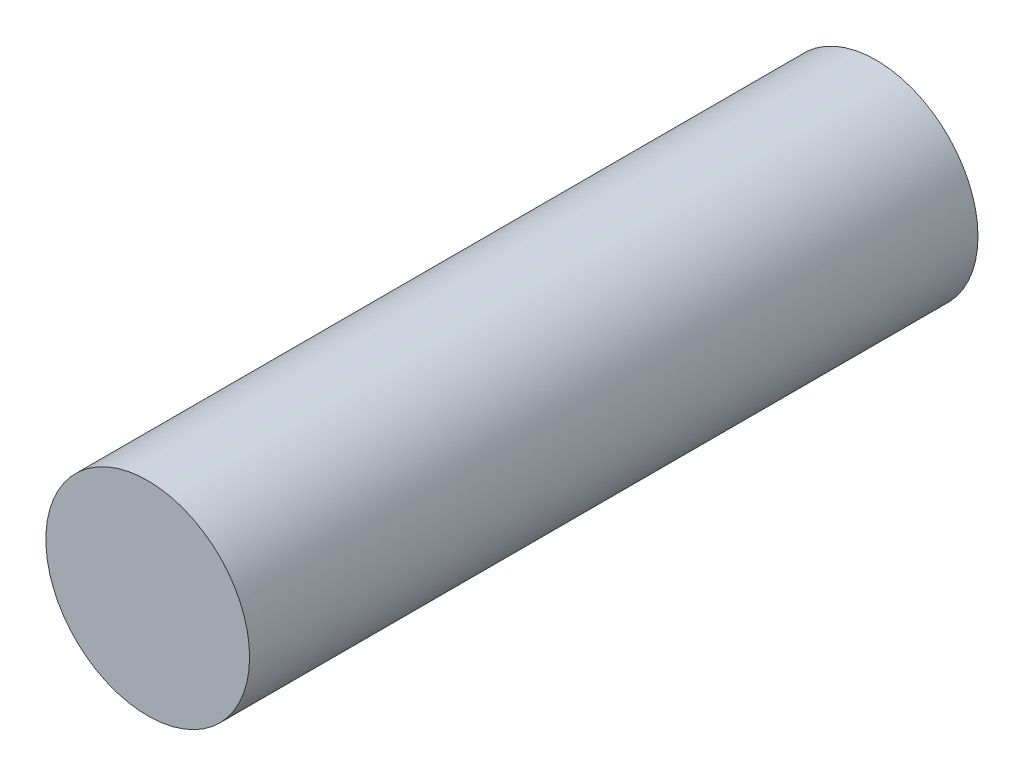
ISO-10303-21;
HEADER;
FILE_DESCRIPTION(('STEP AP214'),'2;1');
FILE_NAME('part.step','',(''),(''),'','','');
FILE_SCHEMA(('AUTOMOTIVE_DESIGN { 1 0 10303 214 1 1 1 1 }'));
ENDSEC;
DATA;
#1=APPLICATION_CONTEXT('core data for automotive mechanical design processes');
#2=APPLICATION_PROTOCOL_DEFINITION('international standard','automotive_design',2000,#1);
#3=PRODUCT_CONTEXT('',#1,'mechanical');
#4=PRODUCT('Part','Part','',(#3));
#5=PRODUCT_RELATED_PRODUCT_CATEGORY('part','',(#4));
#6=PRODUCT_DEFINITION_FORMATION('','',#4);
#7=PRODUCT_DEFINITION_CONTEXT('part definition',#1,'design');
#8=PRODUCT_DEFINITION('design','',#6,#7);
#9=PRODUCT_DEFINITION_SHAPE('','',#8);
#10=(LENGTH_UNIT() NAMED_UNIT(*) SI_UNIT(.MILLI.,.METRE.));
#11=(NAMED_UNIT(*) PLANE_ANGLE_UNIT() SI_UNIT($,.RADIAN.));
#12=(NAMED_UNIT(*) SI_UNIT($,.STERADIAN.) SOLID_ANGLE_UNIT());
#13=UNCERTAINTY_MEASURE_WITH_UNIT(LENGTH_MEASURE(1.E-05),#10,'distance_accuracy_value','');
#14=(GEOMETRIC_REPRESENTATION_CONTEXT(3) GLOBAL_UNCERTAINTY_ASSIGNED_CONTEXT((#13)) GLOBAL_UNIT_ASSIGNED_CONTEXT((#10,
#11,#12)) REPRESENTATION_CONTEXT('',''));
#15=CARTESIAN_POINT('',(0.,0.,0.));
#16=DIRECTION('',(0.,0.,1.));
#17=DIRECTION('',(1.,0.,0.));
#18=AXIS2_PLACEMENT_3D('',#15,#16,#17);
#19=CARTESIAN_POINT('',(0.,0.,14.3));
#20=DIRECTION('',(0.,0.,-1.));
#21=DIRECTION('',(-1.,0.,0.));
#22=AXIS2_PLACEMENT_3D('',#19,#20,#21);
#23=CYLINDRICAL_SURFACE('',#22,2.);
#24=CARTESIAN_POINT('',(0.,0.,14.3));
#25=DIRECTION('',(0.,0.,1.));
#26=DIRECTION('',(1.,0.,0.));
#27=AXIS2_PLACEMENT_3D('',#24,#25,#26);
#28=CIRCLE('',#27,2.);
#29=CARTESIAN_POINT('',(2.,0.,14.3));
#30=VERTEX_POINT('',#29);
#31=EDGE_CURVE('E10',#30,#30,#28,.T.);
#32=ORIENTED_EDGE('',*,*,#31,.F.);
#33=EDGE_LOOP('',(#32));
#34=FACE_BOUND('',#33,.T.);
#35=CARTESIAN_POINT('',(0.,0.,0.));
#36=DIRECTION('',(0.,0.,1.));
#37=DIRECTION('',(1.,0.,0.));
#38=AXIS2_PLACEMENT_3D('',#35,#36,#37);
#39=CIRCLE('',#38,2.);
#40=CARTESIAN_POINT('',(2.,0.,0.));
#41=VERTEX_POINT('',#40);
#42=EDGE_CURVE('E42',#41,#41,#39,.T.);
#43=ORIENTED_EDGE('',*,*,#42,.T.);
#44=EDGE_LOOP('',(#43));
#45=FACE_BOUND('',#44,.T.);
#46=ADVANCED_FACE('F39',(#34,#45),#23,.T.);
#47=CARTESIAN_POINT('',(0.,0.,14.3));
#48=DIRECTION('',(0.,0.,1.));
#49=DIRECTION('',(1.,0.,0.));
#50=AXIS2_PLACEMENT_3D('',#47,#48,#49);
#51=PLANE('',#50);
#52=ORIENTED_EDGE('',*,*,#31,.T.);
#53=EDGE_LOOP('',(#52));
#54=FACE_BOUND('',#53,.T.);
#55=ADVANCED_FACE('F54',(#54),#51,.T.);
#56=CARTESIAN_POINT('',(0.,0.,0.));
#57=DIRECTION('',(0.,0.,1.));
#58=DIRECTION('',(1.,0.,0.));
#59=AXIS2_PLACEMENT_3D('',#56,#57,#58);
#60=PLANE('',#59);
#61=ORIENTED_EDGE('',*,*,#42,.F.);
#62=EDGE_LOOP('',(#61));
#63=FACE_BOUND('',#62,.T.);
#64=ADVANCED_FACE('F52',(#63),#60,.F.);
#65=CLOSED_SHELL('',(#46,#55,#64));
#66=MANIFOLD_SOLID_BREP('B2',#65);
#67=ADVANCED_BREP_SHAPE_REPRESENTATION('',(#18,#66),#14);
#68=SHAPE_DEFINITION_REPRESENTATION(#9,#67);
ENDSEC;
END-ISO-10303-21;
